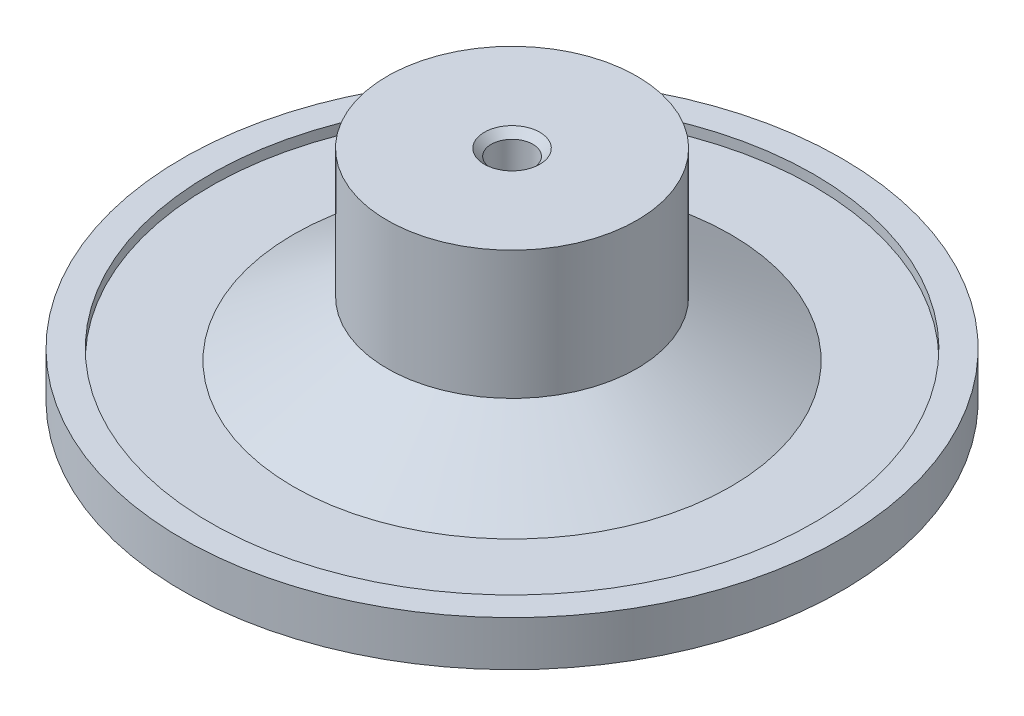
ISO-10303-21;
HEADER;
FILE_DESCRIPTION(('STEP AP214'),'2;1');
FILE_NAME('part.step','',(''),(''),'','','');
FILE_SCHEMA(('AUTOMOTIVE_DESIGN { 1 0 10303 214 1 1 1 1 }'));
ENDSEC;
DATA;
#1=APPLICATION_CONTEXT('core data for automotive mechanical design processes');
#2=APPLICATION_PROTOCOL_DEFINITION('international standard','automotive_design',2000,#1);
#3=PRODUCT_CONTEXT('',#1,'mechanical');
#4=PRODUCT('Part','Part','',(#3));
#5=PRODUCT_RELATED_PRODUCT_CATEGORY('part','',(#4));
#6=PRODUCT_DEFINITION_FORMATION('','',#4);
#7=PRODUCT_DEFINITION_CONTEXT('part definition',#1,'design');
#8=PRODUCT_DEFINITION('design','',#6,#7);
#9=PRODUCT_DEFINITION_SHAPE('','',#8);
#10=(LENGTH_UNIT() NAMED_UNIT(*) SI_UNIT(.MILLI.,.METRE.));
#11=(NAMED_UNIT(*) PLANE_ANGLE_UNIT() SI_UNIT($,.RADIAN.));
#12=(NAMED_UNIT(*) SI_UNIT($,.STERADIAN.) SOLID_ANGLE_UNIT());
#13=UNCERTAINTY_MEASURE_WITH_UNIT(LENGTH_MEASURE(1.E-05),#10,'distance_accuracy_value','');
#14=(GEOMETRIC_REPRESENTATION_CONTEXT(3) GLOBAL_UNCERTAINTY_ASSIGNED_CONTEXT((#13)) GLOBAL_UNIT_ASSIGNED_CONTEXT((#10,
#11,#12)) REPRESENTATION_CONTEXT('',''));
#15=CARTESIAN_POINT('',(0.,0.,0.));
#16=DIRECTION('',(0.,0.,1.));
#17=DIRECTION('',(1.,0.,0.));
#18=AXIS2_PLACEMENT_3D('',#15,#16,#17);
#19=CARTESIAN_POINT('',(225.,0.,0.));
#20=DIRECTION('',(0.,-1.,0.));
#21=DIRECTION('',(0.,0.,-1.));
#22=AXIS2_PLACEMENT_3D('',#19,#20,#21);
#23=PLANE('',#22);
#24=CARTESIAN_POINT('',(0.,0.,0.));
#25=DIRECTION('',(0.,-1.,0.));
#26=DIRECTION('',(0.,0.,-1.));
#27=AXIS2_PLACEMENT_3D('',#24,#25,#26);
#28=CIRCLE('',#27,225.);
#29=CARTESIAN_POINT('',(0.,0.,-225.));
#30=VERTEX_POINT('',#29);
#31=EDGE_CURVE('E77',#30,#30,#28,.T.);
#32=ORIENTED_EDGE('',*,*,#31,.T.);
#33=EDGE_LOOP('',(#32));
#34=FACE_BOUND('',#33,.T.);
#35=CARTESIAN_POINT('',(0.,0.,0.));
#36=DIRECTION('',(0.,-1.,0.));
#37=DIRECTION('',(0.,0.,-1.));
#38=AXIS2_PLACEMENT_3D('',#35,#36,#37);
#39=CIRCLE('',#38,29.9999999999999);
#40=CARTESIAN_POINT('',(0.,0.,-29.9999999999999));
#41=VERTEX_POINT('',#40);
#42=EDGE_CURVE('E10',#41,#41,#39,.T.);
#43=ORIENTED_EDGE('',*,*,#42,.F.);
#44=EDGE_LOOP('',(#43));
#45=FACE_BOUND('',#44,.T.);
#46=ADVANCED_FACE('F31',(#34,#45),#23,.T.);
#47=CARTESIAN_POINT('',(0.,0.,0.));
#48=DIRECTION('',(0.,-1.,0.));
#49=DIRECTION('',(0.,0.,-1.));
#50=AXIS2_PLACEMENT_3D('',#47,#48,#49);
#51=CYLINDRICAL_SURFACE('',#50,29.9999999999999);
#52=ORIENTED_EDGE('',*,*,#42,.T.);
#53=EDGE_LOOP('',(#52));
#54=FACE_BOUND('',#53,.T.);
#55=CARTESIAN_POINT('',(0.,250.,0.));
#56=DIRECTION('',(0.,-1.,0.));
#57=DIRECTION('',(0.,0.,-1.));
#58=AXIS2_PLACEMENT_3D('',#55,#56,#57);
#59=CIRCLE('',#58,29.9999999999999);
#60=CARTESIAN_POINT('',(0.,250.,-29.9999999999999));
#61=VERTEX_POINT('',#60);
#62=EDGE_CURVE('E37',#61,#61,#59,.T.);
#63=ORIENTED_EDGE('',*,*,#62,.F.);
#64=EDGE_LOOP('',(#63));
#65=FACE_BOUND('',#64,.T.);
#66=ADVANCED_FACE('F95',(#54,#65),#51,.F.);
#67=CARTESIAN_POINT('',(0.,260.,0.));
#68=DIRECTION('',(0.,1.,0.));
#69=DIRECTION('',(0.,0.,1.));
#70=AXIS2_PLACEMENT_3D('',#67,#68,#69);
#71=CONICAL_SURFACE('',#70,39.9999999999999,0.785398163397448);
#72=ORIENTED_EDGE('',*,*,#62,.T.);
#73=EDGE_LOOP('',(#72));
#74=FACE_BOUND('',#73,.T.);
#75=CARTESIAN_POINT('',(0.,260.,0.));
#76=DIRECTION('',(0.,-1.,0.));
#77=DIRECTION('',(0.,0.,-1.));
#78=AXIS2_PLACEMENT_3D('',#75,#76,#77);
#79=CIRCLE('',#78,39.9999999999999);
#80=CARTESIAN_POINT('',(0.,260.,-39.9999999999999));
#81=VERTEX_POINT('',#80);
#82=EDGE_CURVE('E41',#81,#81,#79,.T.);
#83=ORIENTED_EDGE('',*,*,#82,.F.);
#84=EDGE_LOOP('',(#83));
#85=FACE_BOUND('',#84,.T.);
#86=ADVANCED_FACE('F99',(#74,#85),#71,.F.);
#87=CARTESIAN_POINT('',(39.9999999999999,260.,0.));
#88=DIRECTION('',(0.,1.,0.));
#89=DIRECTION('',(0.,0.,1.));
#90=AXIS2_PLACEMENT_3D('',#87,#88,#89);
#91=PLANE('',#90);
#92=ORIENTED_EDGE('',*,*,#82,.T.);
#93=EDGE_LOOP('',(#92));
#94=FACE_BOUND('',#93,.T.);
#95=CARTESIAN_POINT('',(0.,260.,0.));
#96=DIRECTION('',(0.,-1.,0.));
#97=DIRECTION('',(0.,0.,-1.));
#98=AXIS2_PLACEMENT_3D('',#95,#96,#97);
#99=CIRCLE('',#98,180.);
#100=CARTESIAN_POINT('',(0.,260.,-180.));
#101=VERTEX_POINT('',#100);
#102=EDGE_CURVE('E45',#101,#101,#99,.T.);
#103=ORIENTED_EDGE('',*,*,#102,.F.);
#104=EDGE_LOOP('',(#103));
#105=FACE_BOUND('',#104,.T.);
#106=ADVANCED_FACE('F103',(#94,#105),#91,.T.);
#107=CARTESIAN_POINT('',(0.,0.,0.));
#108=DIRECTION('',(0.,-1.,0.));
#109=DIRECTION('',(0.,0.,-1.));
#110=AXIS2_PLACEMENT_3D('',#107,#108,#109);
#111=CYLINDRICAL_SURFACE('',#110,180.);
#112=ORIENTED_EDGE('',*,*,#102,.T.);
#113=EDGE_LOOP('',(#112));
#114=FACE_BOUND('',#113,.T.);
#115=CARTESIAN_POINT('',(0.,75.0000000000001,0.));
#116=DIRECTION('',(0.,-1.,0.));
#117=DIRECTION('',(0.,0.,-1.));
#118=AXIS2_PLACEMENT_3D('',#115,#116,#117);
#119=CIRCLE('',#118,180.);
#120=CARTESIAN_POINT('',(0.,75.0000000000001,-180.));
#121=VERTEX_POINT('',#120);
#122=EDGE_CURVE('E50',#121,#121,#119,.T.);
#123=ORIENTED_EDGE('',*,*,#122,.F.);
#124=EDGE_LOOP('',(#123));
#125=FACE_BOUND('',#124,.T.);
#126=ADVANCED_FACE('F109',(#114,#125),#111,.T.);
#127=CARTESIAN_POINT('',(0.,-4.99999999999994,0.));
#128=DIRECTION('',(0.,-1.,0.));
#129=DIRECTION('',(0.,0.,-1.));
#130=AXIS2_PLACEMENT_3D('',#127,#128,#129);
#131=CONICAL_SURFACE('',#130,315.,1.0358412530088);
#132=ORIENTED_EDGE('',*,*,#122,.T.);
#133=EDGE_LOOP('',(#132));
#134=FACE_BOUND('',#133,.T.);
#135=CARTESIAN_POINT('',(0.,-4.99999999999994,0.));
#136=DIRECTION('',(0.,-1.,0.));
#137=DIRECTION('',(0.,0.,-1.));
#138=AXIS2_PLACEMENT_3D('',#135,#136,#137);
#139=CIRCLE('',#138,315.);
#140=CARTESIAN_POINT('',(0.,-4.99999999999994,-315.));
#141=VERTEX_POINT('',#140);
#142=EDGE_CURVE('E53',#141,#141,#139,.T.);
#143=ORIENTED_EDGE('',*,*,#142,.F.);
#144=EDGE_LOOP('',(#143));
#145=FACE_BOUND('',#144,.T.);
#146=ADVANCED_FACE('F113',(#134,#145),#131,.T.);
#147=CARTESIAN_POINT('',(435.,-4.99999999999992,0.));
#148=DIRECTION('',(0.,1.,0.));
#149=DIRECTION('',(0.,0.,1.));
#150=AXIS2_PLACEMENT_3D('',#147,#148,#149);
#151=PLANE('',#150);
#152=ORIENTED_EDGE('',*,*,#142,.T.);
#153=EDGE_LOOP('',(#152));
#154=FACE_BOUND('',#153,.T.);
#155=CARTESIAN_POINT('',(0.,-4.9999999999999,0.));
#156=DIRECTION('',(0.,-1.,0.));
#157=DIRECTION('',(0.,0.,-1.));
#158=AXIS2_PLACEMENT_3D('',#155,#156,#157);
#159=CIRCLE('',#158,435.);
#160=CARTESIAN_POINT('',(0.,-4.9999999999999,-435.));
#161=VERTEX_POINT('',#160);
#162=EDGE_CURVE('E56',#161,#161,#159,.T.);
#163=ORIENTED_EDGE('',*,*,#162,.F.);
#164=EDGE_LOOP('',(#163));
#165=FACE_BOUND('',#164,.T.);
#166=ADVANCED_FACE('F117',(#154,#165),#151,.T.);
#167=CARTESIAN_POINT('',(0.,0.,0.));
#168=DIRECTION('',(0.,-1.,0.));
#169=DIRECTION('',(0.,0.,-1.));
#170=AXIS2_PLACEMENT_3D('',#167,#168,#169);
#171=CYLINDRICAL_SURFACE('',#170,435.);
#172=ORIENTED_EDGE('',*,*,#162,.T.);
#173=EDGE_LOOP('',(#172));
#174=FACE_BOUND('',#173,.T.);
#175=CARTESIAN_POINT('',(0.,10.0000000000001,0.));
#176=DIRECTION('',(0.,-1.,0.));
#177=DIRECTION('',(0.,0.,-1.));
#178=AXIS2_PLACEMENT_3D('',#175,#176,#177);
#179=CIRCLE('',#178,435.);
#180=CARTESIAN_POINT('',(0.,10.0000000000001,-435.));
#181=VERTEX_POINT('',#180);
#182=EDGE_CURVE('E59',#181,#181,#179,.T.);
#183=ORIENTED_EDGE('',*,*,#182,.F.);
#184=EDGE_LOOP('',(#183));
#185=FACE_BOUND('',#184,.T.);
#186=ADVANCED_FACE('F121',(#174,#185),#171,.F.);
#187=CARTESIAN_POINT('',(475.,10.0000000000001,0.));
#188=DIRECTION('',(0.,1.,0.));
#189=DIRECTION('',(0.,0.,1.));
#190=AXIS2_PLACEMENT_3D('',#187,#188,#189);
#191=PLANE('',#190);
#192=ORIENTED_EDGE('',*,*,#182,.T.);
#193=EDGE_LOOP('',(#192));
#194=FACE_BOUND('',#193,.T.);
#195=CARTESIAN_POINT('',(0.,10.0000000000001,0.));
#196=DIRECTION('',(0.,-1.,0.));
#197=DIRECTION('',(0.,0.,-1.));
#198=AXIS2_PLACEMENT_3D('',#195,#196,#197);
#199=CIRCLE('',#198,475.);
#200=CARTESIAN_POINT('',(0.,10.0000000000001,-475.));
#201=VERTEX_POINT('',#200);
#202=EDGE_CURVE('E62',#201,#201,#199,.T.);
#203=ORIENTED_EDGE('',*,*,#202,.F.);
#204=EDGE_LOOP('',(#203));
#205=FACE_BOUND('',#204,.T.);
#206=ADVANCED_FACE('F125',(#194,#205),#191,.T.);
#207=CARTESIAN_POINT('',(0.,0.,0.));
#208=DIRECTION('',(0.,-1.,0.));
#209=DIRECTION('',(0.,0.,-1.));
#210=AXIS2_PLACEMENT_3D('',#207,#208,#209);
#211=CYLINDRICAL_SURFACE('',#210,475.);
#212=ORIENTED_EDGE('',*,*,#202,.T.);
#213=EDGE_LOOP('',(#212));
#214=FACE_BOUND('',#213,.T.);
#215=CARTESIAN_POINT('',(0.,-54.9999999999999,0.));
#216=DIRECTION('',(0.,-1.,0.));
#217=DIRECTION('',(0.,0.,-1.));
#218=AXIS2_PLACEMENT_3D('',#215,#216,#217);
#219=CIRCLE('',#218,475.);
#220=CARTESIAN_POINT('',(0.,-54.9999999999999,-475.));
#221=VERTEX_POINT('',#220);
#222=EDGE_CURVE('E65',#221,#221,#219,.T.);
#223=ORIENTED_EDGE('',*,*,#222,.F.);
#224=EDGE_LOOP('',(#223));
#225=FACE_BOUND('',#224,.T.);
#226=ADVANCED_FACE('F129',(#214,#225),#211,.T.);
#227=CARTESIAN_POINT('',(435.,-54.9999999999999,0.));
#228=DIRECTION('',(0.,-1.,0.));
#229=DIRECTION('',(0.,0.,-1.));
#230=AXIS2_PLACEMENT_3D('',#227,#228,#229);
#231=PLANE('',#230);
#232=ORIENTED_EDGE('',*,*,#222,.T.);
#233=EDGE_LOOP('',(#232));
#234=FACE_BOUND('',#233,.T.);
#235=CARTESIAN_POINT('',(0.,-54.9999999999999,0.));
#236=DIRECTION('',(0.,-1.,0.));
#237=DIRECTION('',(0.,0.,-1.));
#238=AXIS2_PLACEMENT_3D('',#235,#236,#237);
#239=CIRCLE('',#238,435.);
#240=CARTESIAN_POINT('',(0.,-54.9999999999999,-435.));
#241=VERTEX_POINT('',#240);
#242=EDGE_CURVE('E68',#241,#241,#239,.T.);
#243=ORIENTED_EDGE('',*,*,#242,.F.);
#244=EDGE_LOOP('',(#243));
#245=FACE_BOUND('',#244,.T.);
#246=ADVANCED_FACE('F133',(#234,#245),#231,.T.);
#247=CARTESIAN_POINT('',(0.,0.,0.));
#248=DIRECTION('',(0.,-1.,0.));
#249=DIRECTION('',(0.,0.,-1.));
#250=AXIS2_PLACEMENT_3D('',#247,#248,#249);
#251=CYLINDRICAL_SURFACE('',#250,435.);
#252=ORIENTED_EDGE('',*,*,#242,.T.);
#253=EDGE_LOOP('',(#252));
#254=FACE_BOUND('',#253,.T.);
#255=CARTESIAN_POINT('',(0.,-39.9999999999999,0.));
#256=DIRECTION('',(0.,-1.,0.));
#257=DIRECTION('',(0.,0.,-1.));
#258=AXIS2_PLACEMENT_3D('',#255,#256,#257);
#259=CIRCLE('',#258,435.);
#260=CARTESIAN_POINT('',(0.,-39.9999999999999,-435.));
#261=VERTEX_POINT('',#260);
#262=EDGE_CURVE('E71',#261,#261,#259,.T.);
#263=ORIENTED_EDGE('',*,*,#262,.F.);
#264=EDGE_LOOP('',(#263));
#265=FACE_BOUND('',#264,.T.);
#266=ADVANCED_FACE('F91',(#254,#265),#251,.F.);
#267=CARTESIAN_POINT('',(435.,-39.9999999999999,0.));
#268=DIRECTION('',(0.,-1.,0.));
#269=DIRECTION('',(0.,0.,-1.));
#270=AXIS2_PLACEMENT_3D('',#267,#268,#269);
#271=PLANE('',#270);
#272=ORIENTED_EDGE('',*,*,#262,.T.);
#273=EDGE_LOOP('',(#272));
#274=FACE_BOUND('',#273,.T.);
#275=CARTESIAN_POINT('',(0.,-39.9999999999999,0.));
#276=DIRECTION('',(0.,-1.,0.));
#277=DIRECTION('',(0.,0.,-1.));
#278=AXIS2_PLACEMENT_3D('',#275,#276,#277);
#279=CIRCLE('',#278,335.);
#280=CARTESIAN_POINT('',(0.,-39.9999999999999,-335.));
#281=VERTEX_POINT('',#280);
#282=EDGE_CURVE('E74',#281,#281,#279,.T.);
#283=ORIENTED_EDGE('',*,*,#282,.F.);
#284=EDGE_LOOP('',(#283));
#285=FACE_BOUND('',#284,.T.);
#286=ADVANCED_FACE('F85',(#274,#285),#271,.T.);
#287=CARTESIAN_POINT('',(0.,0.,0.));
#288=DIRECTION('',(0.,-1.,0.));
#289=DIRECTION('',(0.,0.,-1.));
#290=AXIS2_PLACEMENT_3D('',#287,#288,#289);
#291=CONICAL_SURFACE('',#290,225.,1.22202532321099);
#292=ORIENTED_EDGE('',*,*,#282,.T.);
#293=EDGE_LOOP('',(#292));
#294=FACE_BOUND('',#293,.T.);
#295=ORIENTED_EDGE('',*,*,#31,.F.);
#296=EDGE_LOOP('',(#295));
#297=FACE_BOUND('',#296,.T.);
#298=ADVANCED_FACE('F83',(#294,#297),#291,.F.);
#299=CLOSED_SHELL('',(#46,#66,#86,#106,#126,#146,#166,#186,#206,#226,#246,#266,#286,#298));
#300=MANIFOLD_SOLID_BREP('B2',#299);
#301=ADVANCED_BREP_SHAPE_REPRESENTATION('',(#18,#300),#14);
#302=SHAPE_DEFINITION_REPRESENTATION(#9,#301);
ENDSEC;
END-ISO-10303-21;
